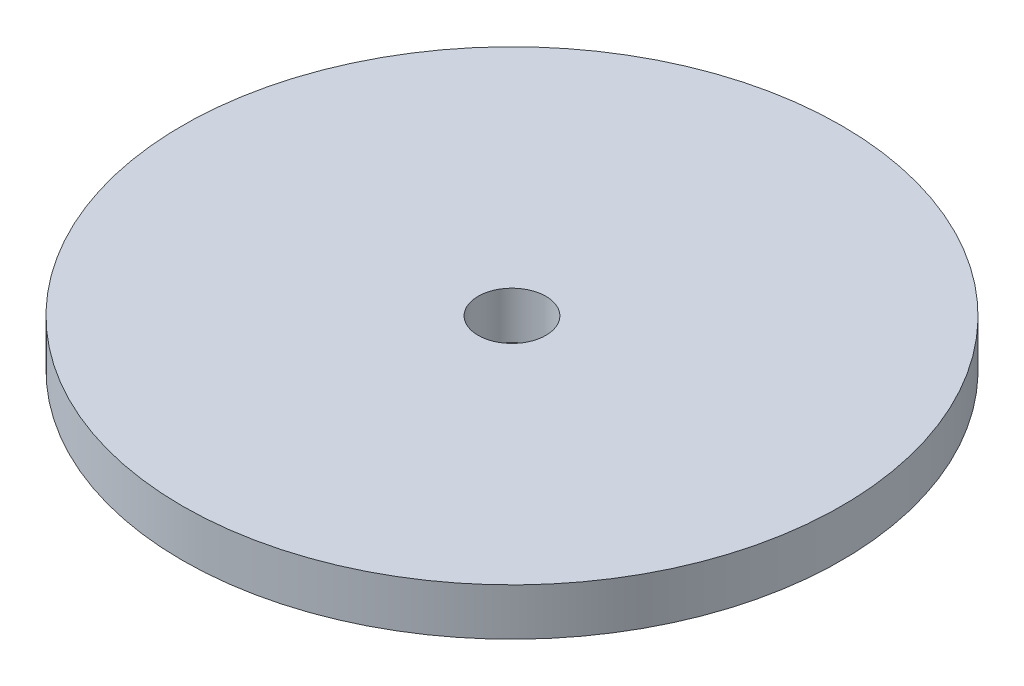
ISO-10303-21;
HEADER;
FILE_DESCRIPTION(('STEP AP214'),'2;1');
FILE_NAME('part.step','',(''),(''),'','','');
FILE_SCHEMA(('AUTOMOTIVE_DESIGN { 1 0 10303 214 1 1 1 1 }'));
ENDSEC;
DATA;
#1=APPLICATION_CONTEXT('core data for automotive mechanical design processes');
#2=APPLICATION_PROTOCOL_DEFINITION('international standard','automotive_design',2000,#1);
#3=PRODUCT_CONTEXT('',#1,'mechanical');
#4=PRODUCT('Part','Part','',(#3));
#5=PRODUCT_RELATED_PRODUCT_CATEGORY('part','',(#4));
#6=PRODUCT_DEFINITION_FORMATION('','',#4);
#7=PRODUCT_DEFINITION_CONTEXT('part definition',#1,'design');
#8=PRODUCT_DEFINITION('design','',#6,#7);
#9=PRODUCT_DEFINITION_SHAPE('','',#8);
#10=(LENGTH_UNIT() NAMED_UNIT(*) SI_UNIT(.MILLI.,.METRE.));
#11=(NAMED_UNIT(*) PLANE_ANGLE_UNIT() SI_UNIT($,.RADIAN.));
#12=(NAMED_UNIT(*) SI_UNIT($,.STERADIAN.) SOLID_ANGLE_UNIT());
#13=UNCERTAINTY_MEASURE_WITH_UNIT(LENGTH_MEASURE(1.E-05),#10,'distance_accuracy_value','');
#14=(GEOMETRIC_REPRESENTATION_CONTEXT(3) GLOBAL_UNCERTAINTY_ASSIGNED_CONTEXT((#13)) GLOBAL_UNIT_ASSIGNED_CONTEXT((#10,
#11,#12)) REPRESENTATION_CONTEXT('',''));
#15=CARTESIAN_POINT('',(0.,0.,0.));
#16=DIRECTION('',(0.,0.,1.));
#17=DIRECTION('',(1.,0.,0.));
#18=AXIS2_PLACEMENT_3D('',#15,#16,#17);
#19=CARTESIAN_POINT('',(0.,6.35,0.));
#20=DIRECTION('',(0.,1.,0.));
#21=DIRECTION('',(0.,0.,1.));
#22=AXIS2_PLACEMENT_3D('',#19,#20,#21);
#23=PLANE('',#22);
#24=CARTESIAN_POINT('',(0.,6.35,0.));
#25=DIRECTION('',(0.,1.,0.));
#26=DIRECTION('',(0.,0.,1.));
#27=AXIS2_PLACEMENT_3D('',#24,#25,#26);
#28=CIRCLE('',#27,44.45);
#29=CARTESIAN_POINT('',(0.,6.35,44.45));
#30=VERTEX_POINT('',#29);
#31=EDGE_CURVE('E10',#30,#30,#28,.T.);
#32=ORIENTED_EDGE('',*,*,#31,.T.);
#33=EDGE_LOOP('',(#32));
#34=FACE_BOUND('',#33,.T.);
#35=CARTESIAN_POINT('',(0.,6.35,0.));
#36=DIRECTION('',(0.,1.,0.));
#37=DIRECTION('',(0.,0.,1.));
#38=AXIS2_PLACEMENT_3D('',#35,#36,#37);
#39=CIRCLE('',#38,4.572);
#40=CARTESIAN_POINT('',(0.,6.35,4.572));
#41=VERTEX_POINT('',#40);
#42=EDGE_CURVE('E42',#41,#41,#39,.T.);
#43=ORIENTED_EDGE('',*,*,#42,.F.);
#44=EDGE_LOOP('',(#43));
#45=FACE_BOUND('',#44,.T.);
#46=ADVANCED_FACE('F31',(#34,#45),#23,.T.);
#47=CARTESIAN_POINT('',(0.,0.,0.));
#48=DIRECTION('',(0.,1.,0.));
#49=DIRECTION('',(0.,0.,1.));
#50=AXIS2_PLACEMENT_3D('',#47,#48,#49);
#51=PLANE('',#50);
#52=CARTESIAN_POINT('',(0.,0.,0.));
#53=DIRECTION('',(0.,1.,0.));
#54=DIRECTION('',(0.,0.,1.));
#55=AXIS2_PLACEMENT_3D('',#52,#53,#54);
#56=CIRCLE('',#55,44.45);
#57=CARTESIAN_POINT('',(0.,0.,44.45));
#58=VERTEX_POINT('',#57);
#59=EDGE_CURVE('E35',#58,#58,#56,.T.);
#60=ORIENTED_EDGE('',*,*,#59,.F.);
#61=EDGE_LOOP('',(#60));
#62=FACE_BOUND('',#61,.T.);
#63=CARTESIAN_POINT('',(0.,0.,0.));
#64=DIRECTION('',(0.,1.,0.));
#65=DIRECTION('',(0.,0.,1.));
#66=AXIS2_PLACEMENT_3D('',#63,#64,#65);
#67=CIRCLE('',#66,4.572);
#68=CARTESIAN_POINT('',(0.,0.,4.572));
#69=VERTEX_POINT('',#68);
#70=EDGE_CURVE('E44',#69,#69,#67,.T.);
#71=ORIENTED_EDGE('',*,*,#70,.T.);
#72=EDGE_LOOP('',(#71));
#73=FACE_BOUND('',#72,.T.);
#74=ADVANCED_FACE('F54',(#62,#73),#51,.F.);
#75=CARTESIAN_POINT('',(0.,6.35,0.));
#76=DIRECTION('',(0.,-1.,0.));
#77=DIRECTION('',(0.,0.,-1.));
#78=AXIS2_PLACEMENT_3D('',#75,#76,#77);
#79=CYLINDRICAL_SURFACE('',#78,44.45);
#80=ORIENTED_EDGE('',*,*,#31,.F.);
#81=EDGE_LOOP('',(#80));
#82=FACE_BOUND('',#81,.T.);
#83=ORIENTED_EDGE('',*,*,#59,.T.);
#84=EDGE_LOOP('',(#83));
#85=FACE_BOUND('',#84,.T.);
#86=ADVANCED_FACE('F33',(#82,#85),#79,.T.);
#87=CARTESIAN_POINT('',(0.,6.35,0.));
#88=DIRECTION('',(0.,-1.,0.));
#89=DIRECTION('',(0.,0.,-1.));
#90=AXIS2_PLACEMENT_3D('',#87,#88,#89);
#91=CYLINDRICAL_SURFACE('',#90,4.572);
#92=ORIENTED_EDGE('',*,*,#42,.T.);
#93=EDGE_LOOP('',(#92));
#94=FACE_BOUND('',#93,.T.);
#95=ORIENTED_EDGE('',*,*,#70,.F.);
#96=EDGE_LOOP('',(#95));
#97=FACE_BOUND('',#96,.T.);
#98=ADVANCED_FACE('F50',(#94,#97),#91,.F.);
#99=CLOSED_SHELL('',(#46,#74,#86,#98));
#100=MANIFOLD_SOLID_BREP('B2',#99);
#101=ADVANCED_BREP_SHAPE_REPRESENTATION('',(#18,#100),#14);
#102=SHAPE_DEFINITION_REPRESENTATION(#9,#101);
ENDSEC;
END-ISO-10303-21;
